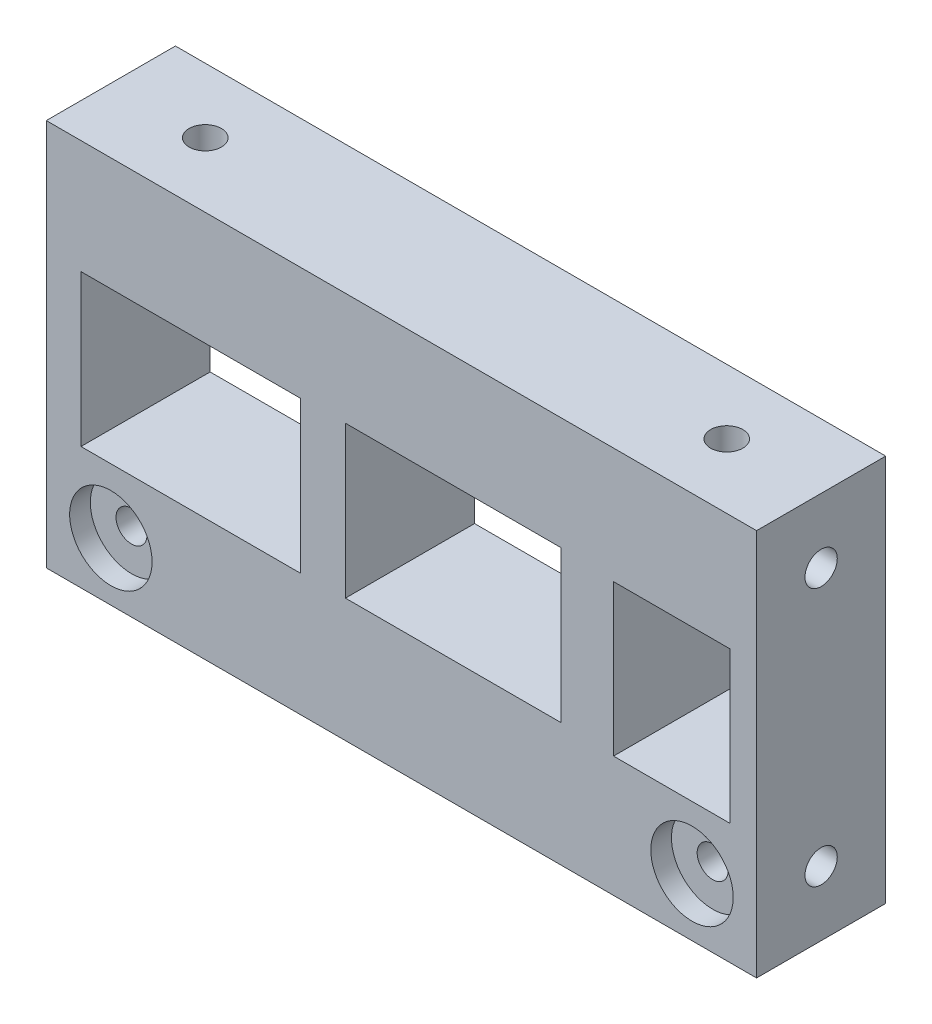
ISO-10303-21;
HEADER;
FILE_DESCRIPTION(('STEP AP214'),'2;1');
FILE_NAME('part.step','',(''),(''),'','','');
FILE_SCHEMA(('AUTOMOTIVE_DESIGN { 1 0 10303 214 1 1 1 1 }'));
ENDSEC;
DATA;
#1=APPLICATION_CONTEXT('core data for automotive mechanical design processes');
#2=APPLICATION_PROTOCOL_DEFINITION('international standard','automotive_design',2000,#1);
#3=PRODUCT_CONTEXT('',#1,'mechanical');
#4=PRODUCT('Part','Part','',(#3));
#5=PRODUCT_RELATED_PRODUCT_CATEGORY('part','',(#4));
#6=PRODUCT_DEFINITION_FORMATION('','',#4);
#7=PRODUCT_DEFINITION_CONTEXT('part definition',#1,'design');
#8=PRODUCT_DEFINITION('design','',#6,#7);
#9=PRODUCT_DEFINITION_SHAPE('','',#8);
#10=(LENGTH_UNIT() NAMED_UNIT(*) SI_UNIT(.MILLI.,.METRE.));
#11=(NAMED_UNIT(*) PLANE_ANGLE_UNIT() SI_UNIT($,.RADIAN.));
#12=(NAMED_UNIT(*) SI_UNIT($,.STERADIAN.) SOLID_ANGLE_UNIT());
#13=UNCERTAINTY_MEASURE_WITH_UNIT(LENGTH_MEASURE(1.E-05),#10,'distance_accuracy_value','');
#14=(GEOMETRIC_REPRESENTATION_CONTEXT(3) GLOBAL_UNCERTAINTY_ASSIGNED_CONTEXT((#13)) GLOBAL_UNIT_ASSIGNED_CONTEXT((#10,
#11,#12)) REPRESENTATION_CONTEXT('',''));
#15=CARTESIAN_POINT('',(0.,0.,0.));
#16=DIRECTION('',(0.,0.,1.));
#17=DIRECTION('',(1.,0.,0.));
#18=AXIS2_PLACEMENT_3D('',#15,#16,#17);
#19=CARTESIAN_POINT('',(0.,0.,0.));
#20=DIRECTION('',(0.,0.,-1.));
#21=DIRECTION('',(-1.,0.,0.));
#22=AXIS2_PLACEMENT_3D('',#19,#20,#21);
#23=PLANE('',#22);
#24=CARTESIAN_POINT('',(-22.5,-10.5,0.));
#25=DIRECTION('',(0.,0.,1.));
#26=DIRECTION('',(1.,0.,0.));
#27=AXIS2_PLACEMENT_3D('',#24,#25,#26);
#28=CIRCLE('',#27,1.2);
#29=CARTESIAN_POINT('',(-21.3,-10.5,0.));
#30=VERTEX_POINT('',#29);
#31=EDGE_CURVE('E254',#30,#30,#28,.T.);
#32=ORIENTED_EDGE('',*,*,#31,.T.);
#33=EDGE_LOOP('',(#32));
#34=FACE_BOUND('',#33,.T.);
#35=DIRECTION('',(0.,-1.,0.));
#36=VECTOR('',#35,1.);
#37=CARTESIAN_POINT('',(-27.5,15.,0.));
#38=LINE('',#37,#36);
#39=CARTESIAN_POINT('',(-27.5,15.,0.));
#40=VERTEX_POINT('',#39);
#41=CARTESIAN_POINT('',(-27.5,-15.,0.));
#42=VERTEX_POINT('',#41);
#43=EDGE_CURVE('E309',#40,#42,#38,.T.);
#44=ORIENTED_EDGE('',*,*,#43,.F.);
#45=DIRECTION('',(-1.,0.,0.));
#46=VECTOR('',#45,1.);
#47=CARTESIAN_POINT('',(27.5,15.,0.));
#48=LINE('',#47,#46);
#49=CARTESIAN_POINT('',(27.5,15.,0.));
#50=VERTEX_POINT('',#49);
#51=EDGE_CURVE('E408',#50,#40,#48,.T.);
#52=ORIENTED_EDGE('',*,*,#51,.F.);
#53=DIRECTION('',(0.,1.,0.));
#54=VECTOR('',#53,1.);
#55=CARTESIAN_POINT('',(27.5,15.,0.));
#56=LINE('',#55,#54);
#57=CARTESIAN_POINT('',(27.5,-15.,0.));
#58=VERTEX_POINT('',#57);
#59=EDGE_CURVE('E424',#58,#50,#56,.T.);
#60=ORIENTED_EDGE('',*,*,#59,.F.);
#61=DIRECTION('',(1.,0.,0.));
#62=VECTOR('',#61,1.);
#63=CARTESIAN_POINT('',(27.5,-15.,0.));
#64=LINE('',#63,#62);
#65=EDGE_CURVE('E421',#42,#58,#64,.T.);
#66=ORIENTED_EDGE('',*,*,#65,.F.);
#67=EDGE_LOOP('',(#44,#52,#60,#66));
#68=FACE_BOUND('',#67,.T.);
#69=DIRECTION('',(0.,-1.,0.));
#70=VECTOR('',#69,1.);
#71=CARTESIAN_POINT('',(16.4234049379665,6.0432442412431,0.));
#72=LINE('',#71,#70);
#73=CARTESIAN_POINT('',(16.4234049379665,6.0432442412431,0.));
#74=VERTEX_POINT('',#73);
#75=CARTESIAN_POINT('',(16.4234049379665,-5.6571127125536,0.));
#76=VERTEX_POINT('',#75);
#77=EDGE_CURVE('E379',#74,#76,#72,.T.);
#78=ORIENTED_EDGE('',*,*,#77,.T.);
#79=DIRECTION('',(1.,0.,0.));
#80=VECTOR('',#79,1.);
#81=CARTESIAN_POINT('',(16.4234049379665,-5.6571127125536,0.));
#82=LINE('',#81,#80);
#83=CARTESIAN_POINT('',(25.4527228042944,-5.6571127125536,0.));
#84=VERTEX_POINT('',#83);
#85=EDGE_CURVE('E396',#76,#84,#82,.T.);
#86=ORIENTED_EDGE('',*,*,#85,.T.);
#87=DIRECTION('',(0.,1.,0.));
#88=VECTOR('',#87,1.);
#89=CARTESIAN_POINT('',(25.4527228042944,6.0432442412431,0.));
#90=LINE('',#89,#88);
#91=CARTESIAN_POINT('',(25.4527228042944,6.0432442412431,0.));
#92=VERTEX_POINT('',#91);
#93=EDGE_CURVE('E392',#84,#92,#90,.T.);
#94=ORIENTED_EDGE('',*,*,#93,.T.);
#95=DIRECTION('',(-1.,0.,0.));
#96=VECTOR('',#95,1.);
#97=CARTESIAN_POINT('',(16.4234049379665,6.0432442412431,0.));
#98=LINE('',#97,#96);
#99=EDGE_CURVE('E365',#92,#74,#98,.T.);
#100=ORIENTED_EDGE('',*,*,#99,.T.);
#101=EDGE_LOOP('',(#78,#86,#94,#100));
#102=FACE_BOUND('',#101,.T.);
#103=DIRECTION('',(0.,-1.,0.));
#104=VECTOR('',#103,1.);
#105=CARTESIAN_POINT('',(-4.33691645548033,6.28718178778567,0.));
#106=LINE('',#105,#104);
#107=CARTESIAN_POINT('',(-4.33691645548033,6.28718178778567,0.));
#108=VERTEX_POINT('',#107);
#109=CARTESIAN_POINT('',(-4.33691645548033,-5.44382173933326,0.));
#110=VERTEX_POINT('',#109);
#111=EDGE_CURVE('E337',#108,#110,#106,.T.);
#112=ORIENTED_EDGE('',*,*,#111,.T.);
#113=DIRECTION('',(1.,0.,0.));
#114=VECTOR('',#113,1.);
#115=CARTESIAN_POINT('',(-4.33691645548033,-5.44382173933326,0.));
#116=LINE('',#115,#114);
#117=CARTESIAN_POINT('',(12.37087644678,-5.44382173933326,0.));
#118=VERTEX_POINT('',#117);
#119=EDGE_CURVE('E354',#110,#118,#116,.T.);
#120=ORIENTED_EDGE('',*,*,#119,.T.);
#121=DIRECTION('',(0.,1.,0.));
#122=VECTOR('',#121,1.);
#123=CARTESIAN_POINT('',(12.37087644678,6.28718178778567,0.));
#124=LINE('',#123,#122);
#125=CARTESIAN_POINT('',(12.37087644678,6.28718178778567,0.));
#126=VERTEX_POINT('',#125);
#127=EDGE_CURVE('E350',#118,#126,#124,.T.);
#128=ORIENTED_EDGE('',*,*,#127,.T.);
#129=DIRECTION('',(-1.,0.,0.));
#130=VECTOR('',#129,1.);
#131=CARTESIAN_POINT('',(-4.33691645548033,6.28718178778567,0.));
#132=LINE('',#131,#130);
#133=EDGE_CURVE('E321',#126,#108,#132,.T.);
#134=ORIENTED_EDGE('',*,*,#133,.T.);
#135=EDGE_LOOP('',(#112,#120,#128,#134));
#136=FACE_BOUND('',#135,.T.);
#137=DIRECTION('',(0.,-1.,0.));
#138=VECTOR('',#137,1.);
#139=CARTESIAN_POINT('',(-24.8128498846334,-5.51491873040671,0.));
#140=LINE('',#139,#138);
#141=CARTESIAN_POINT('',(-24.8128498846334,6.21608479671222,0.));
#142=VERTEX_POINT('',#141);
#143=CARTESIAN_POINT('',(-24.8128498846334,-5.51491873040671,0.));
#144=VERTEX_POINT('',#143);
#145=EDGE_CURVE('E275',#142,#144,#140,.T.);
#146=ORIENTED_EDGE('',*,*,#145,.T.);
#147=DIRECTION('',(1.,0.,0.));
#148=VECTOR('',#147,1.);
#149=CARTESIAN_POINT('',(-24.8128498846334,-5.51491873040671,0.));
#150=LINE('',#149,#148);
#151=CARTESIAN_POINT('',(-7.82066901807928,-5.51491873040671,0.));
#152=VERTEX_POINT('',#151);
#153=EDGE_CURVE('E279',#144,#152,#150,.T.);
#154=ORIENTED_EDGE('',*,*,#153,.T.);
#155=DIRECTION('',(0.,1.,0.));
#156=VECTOR('',#155,1.);
#157=CARTESIAN_POINT('',(-7.82066901807928,-5.51491873040671,0.));
#158=LINE('',#157,#156);
#159=CARTESIAN_POINT('',(-7.82066901807928,6.21608479671222,0.));
#160=VERTEX_POINT('',#159);
#161=EDGE_CURVE('E284',#152,#160,#158,.T.);
#162=ORIENTED_EDGE('',*,*,#161,.T.);
#163=DIRECTION('',(-1.,0.,0.));
#164=VECTOR('',#163,1.);
#165=CARTESIAN_POINT('',(-24.8128498846334,6.21608479671222,0.));
#166=LINE('',#165,#164);
#167=EDGE_CURVE('E288',#160,#142,#166,.T.);
#168=ORIENTED_EDGE('',*,*,#167,.T.);
#169=EDGE_LOOP('',(#146,#154,#162,#168));
#170=FACE_BOUND('',#169,.T.);
#171=CARTESIAN_POINT('',(22.5,-10.5,0.));
#172=DIRECTION('',(0.,0.,1.));
#173=DIRECTION('',(1.,0.,0.));
#174=AXIS2_PLACEMENT_3D('',#171,#172,#173);
#175=CIRCLE('',#174,1.2);
#176=CARTESIAN_POINT('',(23.7,-10.5,0.));
#177=VERTEX_POINT('',#176);
#178=EDGE_CURVE('E270',#177,#177,#175,.T.);
#179=ORIENTED_EDGE('',*,*,#178,.T.);
#180=EDGE_LOOP('',(#179));
#181=FACE_BOUND('',#180,.T.);
#182=ADVANCED_FACE('F55',(#34,#68,#102,#136,#170,#181),#23,.T.);
#183=CARTESIAN_POINT('',(-27.5,15.,10.));
#184=DIRECTION('',(1.,0.,0.));
#185=DIRECTION('',(0.,0.,-1.));
#186=AXIS2_PLACEMENT_3D('',#183,#184,#185);
#187=PLANE('',#186);
#188=CARTESIAN_POINT('',(-27.5,10.,5.));
#189=DIRECTION('',(-1.,0.,0.));
#190=DIRECTION('',(0.,0.,1.));
#191=AXIS2_PLACEMENT_3D('',#188,#189,#190);
#192=CIRCLE('',#191,1.25);
#193=CARTESIAN_POINT('',(-27.5,10.,6.25));
#194=VERTEX_POINT('',#193);
#195=EDGE_CURVE('E197',#194,#194,#192,.T.);
#196=ORIENTED_EDGE('',*,*,#195,.F.);
#197=EDGE_LOOP('',(#196));
#198=FACE_BOUND('',#197,.T.);
#199=CARTESIAN_POINT('',(-27.5,-10.,5.));
#200=DIRECTION('',(-1.,0.,0.));
#201=DIRECTION('',(0.,0.,1.));
#202=AXIS2_PLACEMENT_3D('',#199,#200,#201);
#203=CIRCLE('',#202,1.25);
#204=CARTESIAN_POINT('',(-27.5,-10.,6.25));
#205=VERTEX_POINT('',#204);
#206=EDGE_CURVE('E218',#205,#205,#203,.T.);
#207=ORIENTED_EDGE('',*,*,#206,.F.);
#208=EDGE_LOOP('',(#207));
#209=FACE_BOUND('',#208,.T.);
#210=ORIENTED_EDGE('',*,*,#43,.T.);
#211=DIRECTION('',(0.,0.,-1.));
#212=VECTOR('',#211,1.);
#213=CARTESIAN_POINT('',(-27.5,-15.,10.));
#214=LINE('',#213,#212);
#215=CARTESIAN_POINT('',(-27.5,-15.,10.));
#216=VERTEX_POINT('',#215);
#217=EDGE_CURVE('E11',#216,#42,#214,.T.);
#218=ORIENTED_EDGE('',*,*,#217,.F.);
#219=DIRECTION('',(0.,-1.,0.));
#220=VECTOR('',#219,1.);
#221=CARTESIAN_POINT('',(-27.5,15.,10.));
#222=LINE('',#221,#220);
#223=CARTESIAN_POINT('',(-27.5,15.,10.));
#224=VERTEX_POINT('',#223);
#225=EDGE_CURVE('E403',#224,#216,#222,.T.);
#226=ORIENTED_EDGE('',*,*,#225,.F.);
#227=DIRECTION('',(0.,0.,-1.));
#228=VECTOR('',#227,1.);
#229=CARTESIAN_POINT('',(-27.5,15.,10.));
#230=LINE('',#229,#228);
#231=EDGE_CURVE('E417',#224,#40,#230,.T.);
#232=ORIENTED_EDGE('',*,*,#231,.T.);
#233=EDGE_LOOP('',(#210,#218,#226,#232));
#234=FACE_BOUND('',#233,.T.);
#235=ADVANCED_FACE('F57',(#198,#209,#234),#187,.F.);
#236=CARTESIAN_POINT('',(27.5,-15.,10.));
#237=DIRECTION('',(0.,1.,0.));
#238=DIRECTION('',(0.,0.,1.));
#239=AXIS2_PLACEMENT_3D('',#236,#237,#238);
#240=PLANE('',#239);
#241=ORIENTED_EDGE('',*,*,#65,.T.);
#242=DIRECTION('',(0.,0.,-1.));
#243=VECTOR('',#242,1.);
#244=CARTESIAN_POINT('',(27.5,-15.,10.));
#245=LINE('',#244,#243);
#246=CARTESIAN_POINT('',(27.5,-15.,10.));
#247=VERTEX_POINT('',#246);
#248=EDGE_CURVE('E64',#247,#58,#245,.T.);
#249=ORIENTED_EDGE('',*,*,#248,.F.);
#250=DIRECTION('',(1.,0.,0.));
#251=VECTOR('',#250,1.);
#252=CARTESIAN_POINT('',(27.5,-15.,10.));
#253=LINE('',#252,#251);
#254=EDGE_CURVE('E407',#216,#247,#253,.T.);
#255=ORIENTED_EDGE('',*,*,#254,.F.);
#256=ORIENTED_EDGE('',*,*,#217,.T.);
#257=EDGE_LOOP('',(#241,#249,#255,#256));
#258=FACE_BOUND('',#257,.T.);
#259=ADVANCED_FACE('F457',(#258),#240,.F.);
#260=CARTESIAN_POINT('',(27.5,15.,10.));
#261=DIRECTION('',(-1.,0.,0.));
#262=DIRECTION('',(0.,0.,1.));
#263=AXIS2_PLACEMENT_3D('',#260,#261,#262);
#264=PLANE('',#263);
#265=CARTESIAN_POINT('',(27.5,10.,5.));
#266=DIRECTION('',(1.,0.,0.));
#267=DIRECTION('',(0.,0.,-1.));
#268=AXIS2_PLACEMENT_3D('',#265,#266,#267);
#269=CIRCLE('',#268,1.25);
#270=CARTESIAN_POINT('',(27.5,10.,3.75));
#271=VERTEX_POINT('',#270);
#272=EDGE_CURVE('E196',#271,#271,#269,.T.);
#273=ORIENTED_EDGE('',*,*,#272,.F.);
#274=EDGE_LOOP('',(#273));
#275=FACE_BOUND('',#274,.T.);
#276=CARTESIAN_POINT('',(27.5,-10.,5.));
#277=DIRECTION('',(1.,0.,0.));
#278=DIRECTION('',(0.,0.,-1.));
#279=AXIS2_PLACEMENT_3D('',#276,#277,#278);
#280=CIRCLE('',#279,1.25);
#281=CARTESIAN_POINT('',(27.5,-10.,3.75));
#282=VERTEX_POINT('',#281);
#283=EDGE_CURVE('E210',#282,#282,#280,.T.);
#284=ORIENTED_EDGE('',*,*,#283,.F.);
#285=EDGE_LOOP('',(#284));
#286=FACE_BOUND('',#285,.T.);
#287=ORIENTED_EDGE('',*,*,#59,.T.);
#288=DIRECTION('',(0.,0.,-1.));
#289=VECTOR('',#288,1.);
#290=CARTESIAN_POINT('',(27.5,15.,10.));
#291=LINE('',#290,#289);
#292=CARTESIAN_POINT('',(27.5,15.,10.));
#293=VERTEX_POINT('',#292);
#294=EDGE_CURVE('E432',#293,#50,#291,.T.);
#295=ORIENTED_EDGE('',*,*,#294,.F.);
#296=DIRECTION('',(0.,1.,0.));
#297=VECTOR('',#296,1.);
#298=CARTESIAN_POINT('',(27.5,15.,10.));
#299=LINE('',#298,#297);
#300=EDGE_CURVE('E411',#247,#293,#299,.T.);
#301=ORIENTED_EDGE('',*,*,#300,.F.);
#302=ORIENTED_EDGE('',*,*,#248,.T.);
#303=EDGE_LOOP('',(#287,#295,#301,#302));
#304=FACE_BOUND('',#303,.T.);
#305=ADVANCED_FACE('F441',(#275,#286,#304),#264,.F.);
#306=CARTESIAN_POINT('',(27.5,15.,10.));
#307=DIRECTION('',(0.,-1.,0.));
#308=DIRECTION('',(0.,0.,-1.));
#309=AXIS2_PLACEMENT_3D('',#306,#307,#308);
#310=PLANE('',#309);
#311=CARTESIAN_POINT('',(-20.1915454648592,15.,5.00000000000001));
#312=DIRECTION('',(0.,1.,0.));
#313=DIRECTION('',(0.,0.,1.));
#314=AXIS2_PLACEMENT_3D('',#311,#312,#313);
#315=CIRCLE('',#314,1.25);
#316=CARTESIAN_POINT('',(-20.1915454648592,15.,6.25000000000001));
#317=VERTEX_POINT('',#316);
#318=EDGE_CURVE('E226',#317,#317,#315,.T.);
#319=ORIENTED_EDGE('',*,*,#318,.F.);
#320=EDGE_LOOP('',(#319));
#321=FACE_BOUND('',#320,.T.);
#322=CARTESIAN_POINT('',(20.1915454648592,15.,5.00000000000001));
#323=DIRECTION('',(0.,1.,0.));
#324=DIRECTION('',(0.,0.,1.));
#325=AXIS2_PLACEMENT_3D('',#322,#323,#324);
#326=CIRCLE('',#325,1.25);
#327=CARTESIAN_POINT('',(20.1915454648592,15.,6.25000000000001));
#328=VERTEX_POINT('',#327);
#329=EDGE_CURVE('E234',#328,#328,#326,.T.);
#330=ORIENTED_EDGE('',*,*,#329,.F.);
#331=EDGE_LOOP('',(#330));
#332=FACE_BOUND('',#331,.T.);
#333=ORIENTED_EDGE('',*,*,#51,.T.);
#334=ORIENTED_EDGE('',*,*,#231,.F.);
#335=DIRECTION('',(-1.,0.,0.));
#336=VECTOR('',#335,1.);
#337=CARTESIAN_POINT('',(27.5,15.,10.));
#338=LINE('',#337,#336);
#339=EDGE_CURVE('E414',#293,#224,#338,.T.);
#340=ORIENTED_EDGE('',*,*,#339,.F.);
#341=ORIENTED_EDGE('',*,*,#294,.T.);
#342=EDGE_LOOP('',(#333,#334,#340,#341));
#343=FACE_BOUND('',#342,.T.);
#344=ADVANCED_FACE('F450',(#321,#332,#343),#310,.F.);
#345=CARTESIAN_POINT('',(0.,0.,10.));
#346=DIRECTION('',(0.,0.,-1.));
#347=DIRECTION('',(-1.,0.,0.));
#348=AXIS2_PLACEMENT_3D('',#345,#346,#347);
#349=PLANE('',#348);
#350=CARTESIAN_POINT('',(-22.5,-10.5,10.));
#351=DIRECTION('',(0.,0.,1.));
#352=DIRECTION('',(1.,0.,0.));
#353=AXIS2_PLACEMENT_3D('',#350,#351,#352);
#354=CIRCLE('',#353,3.19);
#355=CARTESIAN_POINT('',(-19.31,-10.5,10.));
#356=VERTEX_POINT('',#355);
#357=EDGE_CURVE('E242',#356,#356,#354,.T.);
#358=ORIENTED_EDGE('',*,*,#357,.F.);
#359=EDGE_LOOP('',(#358));
#360=FACE_BOUND('',#359,.T.);
#361=CARTESIAN_POINT('',(22.5,-10.5,10.));
#362=DIRECTION('',(0.,0.,1.));
#363=DIRECTION('',(1.,0.,0.));
#364=AXIS2_PLACEMENT_3D('',#361,#362,#363);
#365=CIRCLE('',#364,3.19);
#366=CARTESIAN_POINT('',(25.69,-10.5,10.));
#367=VERTEX_POINT('',#366);
#368=EDGE_CURVE('E258',#367,#367,#365,.T.);
#369=ORIENTED_EDGE('',*,*,#368,.F.);
#370=EDGE_LOOP('',(#369));
#371=FACE_BOUND('',#370,.T.);
#372=DIRECTION('',(1.,0.,0.));
#373=VECTOR('',#372,1.);
#374=CARTESIAN_POINT('',(-24.8128498846334,-5.51491873040671,10.));
#375=LINE('',#374,#373);
#376=CARTESIAN_POINT('',(-24.8128498846334,-5.51491873040671,10.));
#377=VERTEX_POINT('',#376);
#378=CARTESIAN_POINT('',(-7.82066901807928,-5.51491873040671,10.));
#379=VERTEX_POINT('',#378);
#380=EDGE_CURVE('E295',#377,#379,#375,.T.);
#381=ORIENTED_EDGE('',*,*,#380,.F.);
#382=DIRECTION('',(0.,-1.,0.));
#383=VECTOR('',#382,1.);
#384=CARTESIAN_POINT('',(-24.8128498846334,-5.51491873040671,10.));
#385=LINE('',#384,#383);
#386=CARTESIAN_POINT('',(-24.8128498846334,6.21608479671222,10.));
#387=VERTEX_POINT('',#386);
#388=EDGE_CURVE('E71',#387,#377,#385,.T.);
#389=ORIENTED_EDGE('',*,*,#388,.F.);
#390=DIRECTION('',(-1.,0.,0.));
#391=VECTOR('',#390,1.);
#392=CARTESIAN_POINT('',(-24.8128498846334,6.21608479671222,10.));
#393=LINE('',#392,#391);
#394=CARTESIAN_POINT('',(-7.82066901807928,6.21608479671222,10.));
#395=VERTEX_POINT('',#394);
#396=EDGE_CURVE('E280',#395,#387,#393,.T.);
#397=ORIENTED_EDGE('',*,*,#396,.F.);
#398=DIRECTION('',(0.,1.,0.));
#399=VECTOR('',#398,1.);
#400=CARTESIAN_POINT('',(-7.82066901807928,-5.51491873040671,10.));
#401=LINE('',#400,#399);
#402=EDGE_CURVE('E299',#379,#395,#401,.T.);
#403=ORIENTED_EDGE('',*,*,#402,.F.);
#404=EDGE_LOOP('',(#381,#389,#397,#403));
#405=FACE_BOUND('',#404,.T.);
#406=DIRECTION('',(1.,0.,0.));
#407=VECTOR('',#406,1.);
#408=CARTESIAN_POINT('',(-4.33691645548033,-5.44382173933326,10.));
#409=LINE('',#408,#407);
#410=CARTESIAN_POINT('',(-4.33691645548033,-5.44382173933326,10.));
#411=VERTEX_POINT('',#410);
#412=CARTESIAN_POINT('',(12.37087644678,-5.44382173933326,10.));
#413=VERTEX_POINT('',#412);
#414=EDGE_CURVE('E341',#411,#413,#409,.T.);
#415=ORIENTED_EDGE('',*,*,#414,.F.);
#416=DIRECTION('',(0.,-1.,0.));
#417=VECTOR('',#416,1.);
#418=CARTESIAN_POINT('',(-4.33691645548033,6.28718178778567,10.));
#419=LINE('',#418,#417);
#420=CARTESIAN_POINT('',(-4.33691645548033,6.28718178778567,10.));
#421=VERTEX_POINT('',#420);
#422=EDGE_CURVE('E79',#421,#411,#419,.T.);
#423=ORIENTED_EDGE('',*,*,#422,.F.);
#424=DIRECTION('',(-1.,0.,0.));
#425=VECTOR('',#424,1.);
#426=CARTESIAN_POINT('',(-4.33691645548033,6.28718178778567,10.));
#427=LINE('',#426,#425);
#428=CARTESIAN_POINT('',(12.37087644678,6.28718178778567,10.));
#429=VERTEX_POINT('',#428);
#430=EDGE_CURVE('E332',#429,#421,#427,.T.);
#431=ORIENTED_EDGE('',*,*,#430,.F.);
#432=DIRECTION('',(0.,1.,0.));
#433=VECTOR('',#432,1.);
#434=CARTESIAN_POINT('',(12.37087644678,6.28718178778567,10.));
#435=LINE('',#434,#433);
#436=EDGE_CURVE('E336',#413,#429,#435,.T.);
#437=ORIENTED_EDGE('',*,*,#436,.F.);
#438=EDGE_LOOP('',(#415,#423,#431,#437));
#439=FACE_BOUND('',#438,.T.);
#440=DIRECTION('',(1.,0.,0.));
#441=VECTOR('',#440,1.);
#442=CARTESIAN_POINT('',(16.4234049379665,-5.6571127125536,10.));
#443=LINE('',#442,#441);
#444=CARTESIAN_POINT('',(16.4234049379665,-5.6571127125536,10.));
#445=VERTEX_POINT('',#444);
#446=CARTESIAN_POINT('',(25.4527228042944,-5.6571127125536,10.));
#447=VERTEX_POINT('',#446);
#448=EDGE_CURVE('E383',#445,#447,#443,.T.);
#449=ORIENTED_EDGE('',*,*,#448,.F.);
#450=DIRECTION('',(0.,-1.,0.));
#451=VECTOR('',#450,1.);
#452=CARTESIAN_POINT('',(16.4234049379665,6.0432442412431,10.));
#453=LINE('',#452,#451);
#454=CARTESIAN_POINT('',(16.4234049379665,6.0432442412431,10.));
#455=VERTEX_POINT('',#454);
#456=EDGE_CURVE('E331',#455,#445,#453,.T.);
#457=ORIENTED_EDGE('',*,*,#456,.F.);
#458=DIRECTION('',(-1.,0.,0.));
#459=VECTOR('',#458,1.);
#460=CARTESIAN_POINT('',(16.4234049379665,6.0432442412431,10.));
#461=LINE('',#460,#459);
#462=CARTESIAN_POINT('',(25.4527228042944,6.0432442412431,10.));
#463=VERTEX_POINT('',#462);
#464=EDGE_CURVE('E374',#463,#455,#461,.T.);
#465=ORIENTED_EDGE('',*,*,#464,.F.);
#466=DIRECTION('',(0.,1.,0.));
#467=VECTOR('',#466,1.);
#468=CARTESIAN_POINT('',(25.4527228042944,6.0432442412431,10.));
#469=LINE('',#468,#467);
#470=EDGE_CURVE('E378',#447,#463,#469,.T.);
#471=ORIENTED_EDGE('',*,*,#470,.F.);
#472=EDGE_LOOP('',(#449,#457,#465,#471));
#473=FACE_BOUND('',#472,.T.);
#474=ORIENTED_EDGE('',*,*,#225,.T.);
#475=ORIENTED_EDGE('',*,*,#254,.T.);
#476=ORIENTED_EDGE('',*,*,#300,.T.);
#477=ORIENTED_EDGE('',*,*,#339,.T.);
#478=EDGE_LOOP('',(#474,#475,#476,#477));
#479=FACE_BOUND('',#478,.T.);
#480=ADVANCED_FACE('F456',(#360,#371,#405,#439,#473,#479),#349,.F.);
#481=CARTESIAN_POINT('',(16.4234049379665,6.0432442412431,0.));
#482=DIRECTION('',(-1.,0.,0.));
#483=DIRECTION('',(0.,0.,1.));
#484=AXIS2_PLACEMENT_3D('',#481,#482,#483);
#485=PLANE('',#484);
#486=ORIENTED_EDGE('',*,*,#456,.T.);
#487=DIRECTION('',(0.,0.,1.));
#488=VECTOR('',#487,1.);
#489=CARTESIAN_POINT('',(16.4234049379665,-5.6571127125536,0.));
#490=LINE('',#489,#488);
#491=EDGE_CURVE('E361',#76,#445,#490,.T.);
#492=ORIENTED_EDGE('',*,*,#491,.F.);
#493=ORIENTED_EDGE('',*,*,#77,.F.);
#494=DIRECTION('',(0.,0.,1.));
#495=VECTOR('',#494,1.);
#496=CARTESIAN_POINT('',(16.4234049379665,6.0432442412431,0.));
#497=LINE('',#496,#495);
#498=EDGE_CURVE('E274',#74,#455,#497,.T.);
#499=ORIENTED_EDGE('',*,*,#498,.T.);
#500=EDGE_LOOP('',(#486,#492,#493,#499));
#501=FACE_BOUND('',#500,.T.);
#502=ADVANCED_FACE('F483',(#501),#485,.F.);
#503=CARTESIAN_POINT('',(16.4234049379665,6.0432442412431,0.));
#504=DIRECTION('',(0.,1.,0.));
#505=DIRECTION('',(0.,0.,1.));
#506=AXIS2_PLACEMENT_3D('',#503,#504,#505);
#507=PLANE('',#506);
#508=ORIENTED_EDGE('',*,*,#464,.T.);
#509=ORIENTED_EDGE('',*,*,#498,.F.);
#510=ORIENTED_EDGE('',*,*,#99,.F.);
#511=DIRECTION('',(0.,0.,1.));
#512=VECTOR('',#511,1.);
#513=CARTESIAN_POINT('',(25.4527228042944,6.0432442412431,0.));
#514=LINE('',#513,#512);
#515=EDGE_CURVE('E369',#92,#463,#514,.T.);
#516=ORIENTED_EDGE('',*,*,#515,.T.);
#517=EDGE_LOOP('',(#508,#509,#510,#516));
#518=FACE_BOUND('',#517,.T.);
#519=ADVANCED_FACE('F563',(#518),#507,.F.);
#520=CARTESIAN_POINT('',(25.4527228042944,6.0432442412431,0.));
#521=DIRECTION('',(1.,0.,0.));
#522=DIRECTION('',(0.,0.,-1.));
#523=AXIS2_PLACEMENT_3D('',#520,#521,#522);
#524=PLANE('',#523);
#525=ORIENTED_EDGE('',*,*,#470,.T.);
#526=ORIENTED_EDGE('',*,*,#515,.F.);
#527=ORIENTED_EDGE('',*,*,#93,.F.);
#528=DIRECTION('',(0.,0.,1.));
#529=VECTOR('',#528,1.);
#530=CARTESIAN_POINT('',(25.4527228042944,-5.6571127125536,0.));
#531=LINE('',#530,#529);
#532=EDGE_CURVE('E366',#84,#447,#531,.T.);
#533=ORIENTED_EDGE('',*,*,#532,.T.);
#534=EDGE_LOOP('',(#525,#526,#527,#533));
#535=FACE_BOUND('',#534,.T.);
#536=ADVANCED_FACE('F567',(#535),#524,.F.);
#537=CARTESIAN_POINT('',(16.4234049379665,-5.6571127125536,0.));
#538=DIRECTION('',(0.,-1.,0.));
#539=DIRECTION('',(0.,0.,-1.));
#540=AXIS2_PLACEMENT_3D('',#537,#538,#539);
#541=PLANE('',#540);
#542=ORIENTED_EDGE('',*,*,#448,.T.);
#543=ORIENTED_EDGE('',*,*,#532,.F.);
#544=ORIENTED_EDGE('',*,*,#85,.F.);
#545=ORIENTED_EDGE('',*,*,#491,.T.);
#546=EDGE_LOOP('',(#542,#543,#544,#545));
#547=FACE_BOUND('',#546,.T.);
#548=ADVANCED_FACE('F551',(#547),#541,.F.);
#549=CARTESIAN_POINT('',(-4.33691645548033,6.28718178778567,0.));
#550=DIRECTION('',(-1.,0.,0.));
#551=DIRECTION('',(0.,-1.,0.));
#552=AXIS2_PLACEMENT_3D('',#549,#550,#551);
#553=PLANE('',#552);
#554=ORIENTED_EDGE('',*,*,#422,.T.);
#555=DIRECTION('',(0.,0.,1.));
#556=VECTOR('',#555,1.);
#557=CARTESIAN_POINT('',(-4.33691645548033,-5.44382173933326,0.));
#558=LINE('',#557,#556);
#559=EDGE_CURVE('E318',#110,#411,#558,.T.);
#560=ORIENTED_EDGE('',*,*,#559,.F.);
#561=ORIENTED_EDGE('',*,*,#111,.F.);
#562=DIRECTION('',(0.,0.,1.));
#563=VECTOR('',#562,1.);
#564=CARTESIAN_POINT('',(-4.33691645548033,6.28718178778567,0.));
#565=LINE('',#564,#563);
#566=EDGE_CURVE('E328',#108,#421,#565,.T.);
#567=ORIENTED_EDGE('',*,*,#566,.T.);
#568=EDGE_LOOP('',(#554,#560,#561,#567));
#569=FACE_BOUND('',#568,.T.);
#570=ADVANCED_FACE('F547',(#569),#553,.F.);
#571=CARTESIAN_POINT('',(-4.33691645548033,6.28718178778567,0.));
#572=DIRECTION('',(0.,1.,0.));
#573=DIRECTION('',(0.,0.,1.));
#574=AXIS2_PLACEMENT_3D('',#571,#572,#573);
#575=PLANE('',#574);
#576=ORIENTED_EDGE('',*,*,#430,.T.);
#577=ORIENTED_EDGE('',*,*,#566,.F.);
#578=ORIENTED_EDGE('',*,*,#133,.F.);
#579=DIRECTION('',(0.,0.,1.));
#580=VECTOR('',#579,1.);
#581=CARTESIAN_POINT('',(12.37087644678,6.28718178778567,0.));
#582=LINE('',#581,#580);
#583=EDGE_CURVE('E325',#126,#429,#582,.T.);
#584=ORIENTED_EDGE('',*,*,#583,.T.);
#585=EDGE_LOOP('',(#576,#577,#578,#584));
#586=FACE_BOUND('',#585,.T.);
#587=ADVANCED_FACE('F550',(#586),#575,.F.);
#588=CARTESIAN_POINT('',(12.37087644678,6.28718178778567,0.));
#589=DIRECTION('',(1.,0.,0.));
#590=DIRECTION('',(0.,1.,0.));
#591=AXIS2_PLACEMENT_3D('',#588,#589,#590);
#592=PLANE('',#591);
#593=ORIENTED_EDGE('',*,*,#436,.T.);
#594=ORIENTED_EDGE('',*,*,#583,.F.);
#595=ORIENTED_EDGE('',*,*,#127,.F.);
#596=DIRECTION('',(0.,0.,1.));
#597=VECTOR('',#596,1.);
#598=CARTESIAN_POINT('',(12.37087644678,-5.44382173933326,0.));
#599=LINE('',#598,#597);
#600=EDGE_CURVE('E322',#118,#413,#599,.T.);
#601=ORIENTED_EDGE('',*,*,#600,.T.);
#602=EDGE_LOOP('',(#593,#594,#595,#601));
#603=FACE_BOUND('',#602,.T.);
#604=ADVANCED_FACE('F554',(#603),#592,.F.);
#605=CARTESIAN_POINT('',(-4.33691645548033,-5.44382173933326,0.));
#606=DIRECTION('',(0.,-1.,0.));
#607=DIRECTION('',(0.,0.,-1.));
#608=AXIS2_PLACEMENT_3D('',#605,#606,#607);
#609=PLANE('',#608);
#610=ORIENTED_EDGE('',*,*,#414,.T.);
#611=ORIENTED_EDGE('',*,*,#600,.F.);
#612=ORIENTED_EDGE('',*,*,#119,.F.);
#613=ORIENTED_EDGE('',*,*,#559,.T.);
#614=EDGE_LOOP('',(#610,#611,#612,#613));
#615=FACE_BOUND('',#614,.T.);
#616=ADVANCED_FACE('F546',(#615),#609,.F.);
#617=CARTESIAN_POINT('',(-24.8128498846334,-5.51491873040671,0.));
#618=DIRECTION('',(-1.,0.,0.));
#619=DIRECTION('',(0.,0.,1.));
#620=AXIS2_PLACEMENT_3D('',#617,#618,#619);
#621=PLANE('',#620);
#622=ORIENTED_EDGE('',*,*,#388,.T.);
#623=DIRECTION('',(0.,0.,1.));
#624=VECTOR('',#623,1.);
#625=CARTESIAN_POINT('',(-24.8128498846334,-5.51491873040671,0.));
#626=LINE('',#625,#624);
#627=EDGE_CURVE('E292',#144,#377,#626,.T.);
#628=ORIENTED_EDGE('',*,*,#627,.F.);
#629=ORIENTED_EDGE('',*,*,#145,.F.);
#630=DIRECTION('',(0.,0.,1.));
#631=VECTOR('',#630,1.);
#632=CARTESIAN_POINT('',(-24.8128498846334,6.21608479671222,0.));
#633=LINE('',#632,#631);
#634=EDGE_CURVE('E306',#142,#387,#633,.T.);
#635=ORIENTED_EDGE('',*,*,#634,.T.);
#636=EDGE_LOOP('',(#622,#628,#629,#635));
#637=FACE_BOUND('',#636,.T.);
#638=ADVANCED_FACE('F537',(#637),#621,.F.);
#639=CARTESIAN_POINT('',(-24.8128498846334,6.21608479671222,0.));
#640=DIRECTION('',(0.,1.,0.));
#641=DIRECTION('',(0.,0.,1.));
#642=AXIS2_PLACEMENT_3D('',#639,#640,#641);
#643=PLANE('',#642);
#644=ORIENTED_EDGE('',*,*,#396,.T.);
#645=ORIENTED_EDGE('',*,*,#634,.F.);
#646=ORIENTED_EDGE('',*,*,#167,.F.);
#647=DIRECTION('',(0.,0.,1.));
#648=VECTOR('',#647,1.);
#649=CARTESIAN_POINT('',(-7.82066901807928,6.21608479671222,0.));
#650=LINE('',#649,#648);
#651=EDGE_CURVE('E310',#160,#395,#650,.T.);
#652=ORIENTED_EDGE('',*,*,#651,.T.);
#653=EDGE_LOOP('',(#644,#645,#646,#652));
#654=FACE_BOUND('',#653,.T.);
#655=ADVANCED_FACE('F533',(#654),#643,.F.);
#656=CARTESIAN_POINT('',(-7.82066901807928,-5.51491873040671,0.));
#657=DIRECTION('',(1.,0.,0.));
#658=DIRECTION('',(0.,0.,-1.));
#659=AXIS2_PLACEMENT_3D('',#656,#657,#658);
#660=PLANE('',#659);
#661=ORIENTED_EDGE('',*,*,#402,.T.);
#662=ORIENTED_EDGE('',*,*,#651,.F.);
#663=ORIENTED_EDGE('',*,*,#161,.F.);
#664=DIRECTION('',(0.,0.,1.));
#665=VECTOR('',#664,1.);
#666=CARTESIAN_POINT('',(-7.82066901807928,-5.51491873040671,0.));
#667=LINE('',#666,#665);
#668=EDGE_CURVE('E313',#152,#379,#667,.T.);
#669=ORIENTED_EDGE('',*,*,#668,.T.);
#670=EDGE_LOOP('',(#661,#662,#663,#669));
#671=FACE_BOUND('',#670,.T.);
#672=ADVANCED_FACE('F536',(#671),#660,.F.);
#673=CARTESIAN_POINT('',(-24.8128498846334,-5.51491873040671,0.));
#674=DIRECTION('',(0.,-1.,0.));
#675=DIRECTION('',(0.,0.,-1.));
#676=AXIS2_PLACEMENT_3D('',#673,#674,#675);
#677=PLANE('',#676);
#678=ORIENTED_EDGE('',*,*,#380,.T.);
#679=ORIENTED_EDGE('',*,*,#668,.F.);
#680=ORIENTED_EDGE('',*,*,#153,.F.);
#681=ORIENTED_EDGE('',*,*,#627,.T.);
#682=EDGE_LOOP('',(#678,#679,#680,#681));
#683=FACE_BOUND('',#682,.T.);
#684=ADVANCED_FACE('F531',(#683),#677,.F.);
#685=CARTESIAN_POINT('',(22.5,-10.5,10.));
#686=DIRECTION('',(0.,0.,1.));
#687=DIRECTION('',(1.,0.,0.));
#688=AXIS2_PLACEMENT_3D('',#685,#686,#687);
#689=CYLINDRICAL_SURFACE('',#688,1.2);
#690=ORIENTED_EDGE('',*,*,#178,.F.);
#691=EDGE_LOOP('',(#690));
#692=FACE_BOUND('',#691,.T.);
#693=CARTESIAN_POINT('',(22.5,-10.5,8.4));
#694=DIRECTION('',(0.,0.,1.));
#695=DIRECTION('',(1.,0.,0.));
#696=AXIS2_PLACEMENT_3D('',#693,#694,#695);
#697=CIRCLE('',#696,1.2);
#698=CARTESIAN_POINT('',(23.7,-10.5,8.4));
#699=VERTEX_POINT('',#698);
#700=EDGE_CURVE('E266',#699,#699,#697,.T.);
#701=ORIENTED_EDGE('',*,*,#700,.T.);
#702=EDGE_LOOP('',(#701));
#703=FACE_BOUND('',#702,.T.);
#704=ADVANCED_FACE('F527',(#692,#703),#689,.F.);
#705=CARTESIAN_POINT('',(23.7,-10.5,8.4));
#706=DIRECTION('',(0.,0.,-1.));
#707=DIRECTION('',(-1.,0.,0.));
#708=AXIS2_PLACEMENT_3D('',#705,#706,#707);
#709=PLANE('',#708);
#710=ORIENTED_EDGE('',*,*,#700,.F.);
#711=EDGE_LOOP('',(#710));
#712=FACE_BOUND('',#711,.T.);
#713=CARTESIAN_POINT('',(22.5,-10.5,8.4));
#714=DIRECTION('',(0.,0.,1.));
#715=DIRECTION('',(1.,0.,0.));
#716=AXIS2_PLACEMENT_3D('',#713,#714,#715);
#717=CIRCLE('',#716,3.19);
#718=CARTESIAN_POINT('',(25.69,-10.5,8.4));
#719=VERTEX_POINT('',#718);
#720=EDGE_CURVE('E262',#719,#719,#717,.T.);
#721=ORIENTED_EDGE('',*,*,#720,.T.);
#722=EDGE_LOOP('',(#721));
#723=FACE_BOUND('',#722,.T.);
#724=ADVANCED_FACE('F523',(#712,#723),#709,.F.);
#725=CARTESIAN_POINT('',(22.5,-10.5,10.));
#726=DIRECTION('',(0.,0.,1.));
#727=DIRECTION('',(1.,0.,0.));
#728=AXIS2_PLACEMENT_3D('',#725,#726,#727);
#729=CYLINDRICAL_SURFACE('',#728,3.19);
#730=ORIENTED_EDGE('',*,*,#720,.F.);
#731=EDGE_LOOP('',(#730));
#732=FACE_BOUND('',#731,.T.);
#733=ORIENTED_EDGE('',*,*,#368,.T.);
#734=EDGE_LOOP('',(#733));
#735=FACE_BOUND('',#734,.T.);
#736=ADVANCED_FACE('F519',(#732,#735),#729,.F.);
#737=CARTESIAN_POINT('',(-22.5,-10.5,10.));
#738=DIRECTION('',(0.,0.,1.));
#739=DIRECTION('',(1.,0.,0.));
#740=AXIS2_PLACEMENT_3D('',#737,#738,#739);
#741=CYLINDRICAL_SURFACE('',#740,1.2);
#742=ORIENTED_EDGE('',*,*,#31,.F.);
#743=EDGE_LOOP('',(#742));
#744=FACE_BOUND('',#743,.T.);
#745=CARTESIAN_POINT('',(-22.5,-10.5,8.4));
#746=DIRECTION('',(0.,0.,1.));
#747=DIRECTION('',(1.,0.,0.));
#748=AXIS2_PLACEMENT_3D('',#745,#746,#747);
#749=CIRCLE('',#748,1.2);
#750=CARTESIAN_POINT('',(-21.3,-10.5,8.4));
#751=VERTEX_POINT('',#750);
#752=EDGE_CURVE('E250',#751,#751,#749,.T.);
#753=ORIENTED_EDGE('',*,*,#752,.T.);
#754=EDGE_LOOP('',(#753));
#755=FACE_BOUND('',#754,.T.);
#756=ADVANCED_FACE('F515',(#744,#755),#741,.F.);
#757=CARTESIAN_POINT('',(-21.3,-10.5,8.4));
#758=DIRECTION('',(0.,0.,-1.));
#759=DIRECTION('',(-1.,0.,0.));
#760=AXIS2_PLACEMENT_3D('',#757,#758,#759);
#761=PLANE('',#760);
#762=ORIENTED_EDGE('',*,*,#752,.F.);
#763=EDGE_LOOP('',(#762));
#764=FACE_BOUND('',#763,.T.);
#765=CARTESIAN_POINT('',(-22.5,-10.5,8.4));
#766=DIRECTION('',(0.,0.,1.));
#767=DIRECTION('',(1.,0.,0.));
#768=AXIS2_PLACEMENT_3D('',#765,#766,#767);
#769=CIRCLE('',#768,3.19);
#770=CARTESIAN_POINT('',(-19.31,-10.5,8.4));
#771=VERTEX_POINT('',#770);
#772=EDGE_CURVE('E246',#771,#771,#769,.T.);
#773=ORIENTED_EDGE('',*,*,#772,.T.);
#774=EDGE_LOOP('',(#773));
#775=FACE_BOUND('',#774,.T.);
#776=ADVANCED_FACE('F511',(#764,#775),#761,.F.);
#777=CARTESIAN_POINT('',(-22.5,-10.5,10.));
#778=DIRECTION('',(0.,0.,1.));
#779=DIRECTION('',(1.,0.,0.));
#780=AXIS2_PLACEMENT_3D('',#777,#778,#779);
#781=CYLINDRICAL_SURFACE('',#780,3.19);
#782=ORIENTED_EDGE('',*,*,#772,.F.);
#783=EDGE_LOOP('',(#782));
#784=FACE_BOUND('',#783,.T.);
#785=ORIENTED_EDGE('',*,*,#357,.T.);
#786=EDGE_LOOP('',(#785));
#787=FACE_BOUND('',#786,.T.);
#788=ADVANCED_FACE('F504',(#784,#787),#781,.F.);
#789=CARTESIAN_POINT('',(20.1915454648592,12.,5.00000000000001));
#790=DIRECTION('',(0.,1.,0.));
#791=DIRECTION('',(0.,0.,1.));
#792=AXIS2_PLACEMENT_3D('',#789,#790,#791);
#793=CONICAL_SURFACE('',#792,1.25,1.02974425867665);
#794=CARTESIAN_POINT('',(20.1915454648592,11.2489242262155,5.00000000000001));
#795=VERTEX_POINT('',#794);
#796=VERTEX_LOOP('',#795);
#797=FACE_BOUND('',#796,.T.);
#798=CARTESIAN_POINT('',(20.1915454648592,12.,5.00000000000001));
#799=DIRECTION('',(0.,1.,0.));
#800=DIRECTION('',(0.,0.,1.));
#801=AXIS2_PLACEMENT_3D('',#798,#799,#800);
#802=CIRCLE('',#801,1.25);
#803=CARTESIAN_POINT('',(20.1915454648592,12.,6.25000000000001));
#804=VERTEX_POINT('',#803);
#805=EDGE_CURVE('E238',#804,#804,#802,.T.);
#806=ORIENTED_EDGE('',*,*,#805,.T.);
#807=EDGE_LOOP('',(#806));
#808=FACE_BOUND('',#807,.T.);
#809=ADVANCED_FACE('F492',(#797,#808),#793,.F.);
#810=CARTESIAN_POINT('',(20.1915454648592,15.,5.00000000000001));
#811=DIRECTION('',(0.,1.,0.));
#812=DIRECTION('',(0.,0.,1.));
#813=AXIS2_PLACEMENT_3D('',#810,#811,#812);
#814=CYLINDRICAL_SURFACE('',#813,1.25);
#815=ORIENTED_EDGE('',*,*,#805,.F.);
#816=EDGE_LOOP('',(#815));
#817=FACE_BOUND('',#816,.T.);
#818=ORIENTED_EDGE('',*,*,#329,.T.);
#819=EDGE_LOOP('',(#818));
#820=FACE_BOUND('',#819,.T.);
#821=ADVANCED_FACE('F489',(#817,#820),#814,.F.);
#822=CARTESIAN_POINT('',(-20.1915454648592,12.,5.00000000000001));
#823=DIRECTION('',(0.,1.,0.));
#824=DIRECTION('',(0.,0.,1.));
#825=AXIS2_PLACEMENT_3D('',#822,#823,#824);
#826=CONICAL_SURFACE('',#825,1.25,1.02974425867665);
#827=CARTESIAN_POINT('',(-20.1915454648592,11.2489242262155,5.00000000000001));
#828=VERTEX_POINT('',#827);
#829=VERTEX_LOOP('',#828);
#830=FACE_BOUND('',#829,.T.);
#831=CARTESIAN_POINT('',(-20.1915454648592,12.,5.00000000000001));
#832=DIRECTION('',(0.,1.,0.));
#833=DIRECTION('',(0.,0.,1.));
#834=AXIS2_PLACEMENT_3D('',#831,#832,#833);
#835=CIRCLE('',#834,1.25);
#836=CARTESIAN_POINT('',(-20.1915454648592,12.,6.25000000000001));
#837=VERTEX_POINT('',#836);
#838=EDGE_CURVE('E230',#837,#837,#835,.T.);
#839=ORIENTED_EDGE('',*,*,#838,.T.);
#840=EDGE_LOOP('',(#839));
#841=FACE_BOUND('',#840,.T.);
#842=ADVANCED_FACE('F491',(#830,#841),#826,.F.);
#843=CARTESIAN_POINT('',(-20.1915454648592,15.,5.00000000000001));
#844=DIRECTION('',(0.,1.,0.));
#845=DIRECTION('',(0.,0.,1.));
#846=AXIS2_PLACEMENT_3D('',#843,#844,#845);
#847=CYLINDRICAL_SURFACE('',#846,1.25);
#848=ORIENTED_EDGE('',*,*,#838,.F.);
#849=EDGE_LOOP('',(#848));
#850=FACE_BOUND('',#849,.T.);
#851=ORIENTED_EDGE('',*,*,#318,.T.);
#852=EDGE_LOOP('',(#851));
#853=FACE_BOUND('',#852,.T.);
#854=ADVANCED_FACE('F500',(#850,#853),#847,.F.);
#855=CARTESIAN_POINT('',(-24.5,-10.,5.));
#856=DIRECTION('',(-1.,0.,0.));
#857=DIRECTION('',(0.,0.,1.));
#858=AXIS2_PLACEMENT_3D('',#855,#856,#857);
#859=CONICAL_SURFACE('',#858,1.25,1.02974425867665);
#860=CARTESIAN_POINT('',(-23.7489242262155,-10.,5.));
#861=VERTEX_POINT('',#860);
#862=VERTEX_LOOP('',#861);
#863=FACE_BOUND('',#862,.T.);
#864=CARTESIAN_POINT('',(-24.5,-10.,5.));
#865=DIRECTION('',(-1.,0.,0.));
#866=DIRECTION('',(0.,0.,1.));
#867=AXIS2_PLACEMENT_3D('',#864,#865,#866);
#868=CIRCLE('',#867,1.25);
#869=CARTESIAN_POINT('',(-24.5,-10.,6.25));
#870=VERTEX_POINT('',#869);
#871=EDGE_CURVE('E222',#870,#870,#868,.T.);
#872=ORIENTED_EDGE('',*,*,#871,.T.);
#873=EDGE_LOOP('',(#872));
#874=FACE_BOUND('',#873,.T.);
#875=ADVANCED_FACE('F738',(#863,#874),#859,.F.);
#876=CARTESIAN_POINT('',(-27.5,-10.,5.));
#877=DIRECTION('',(-1.,0.,0.));
#878=DIRECTION('',(0.,0.,1.));
#879=AXIS2_PLACEMENT_3D('',#876,#877,#878);
#880=CYLINDRICAL_SURFACE('',#879,1.25);
#881=ORIENTED_EDGE('',*,*,#871,.F.);
#882=EDGE_LOOP('',(#881));
#883=FACE_BOUND('',#882,.T.);
#884=ORIENTED_EDGE('',*,*,#206,.T.);
#885=EDGE_LOOP('',(#884));
#886=FACE_BOUND('',#885,.T.);
#887=ADVANCED_FACE('F748',(#883,#886),#880,.F.);
#888=CARTESIAN_POINT('',(24.5,-10.,5.));
#889=DIRECTION('',(1.,0.,0.));
#890=DIRECTION('',(0.,0.,-1.));
#891=AXIS2_PLACEMENT_3D('',#888,#889,#890);
#892=CONICAL_SURFACE('',#891,1.25,1.02974425867665);
#893=CARTESIAN_POINT('',(23.7489242262155,-10.,5.));
#894=VERTEX_POINT('',#893);
#895=VERTEX_LOOP('',#894);
#896=FACE_BOUND('',#895,.T.);
#897=CARTESIAN_POINT('',(24.5,-10.,5.));
#898=DIRECTION('',(1.,0.,0.));
#899=DIRECTION('',(0.,0.,-1.));
#900=AXIS2_PLACEMENT_3D('',#897,#898,#899);
#901=CIRCLE('',#900,1.25);
#902=CARTESIAN_POINT('',(24.5,-10.,3.75));
#903=VERTEX_POINT('',#902);
#904=EDGE_CURVE('E214',#903,#903,#901,.T.);
#905=ORIENTED_EDGE('',*,*,#904,.T.);
#906=EDGE_LOOP('',(#905));
#907=FACE_BOUND('',#906,.T.);
#908=ADVANCED_FACE('F759',(#896,#907),#892,.F.);
#909=CARTESIAN_POINT('',(27.5,-10.,5.));
#910=DIRECTION('',(1.,0.,0.));
#911=DIRECTION('',(0.,0.,-1.));
#912=AXIS2_PLACEMENT_3D('',#909,#910,#911);
#913=CYLINDRICAL_SURFACE('',#912,1.25);
#914=ORIENTED_EDGE('',*,*,#904,.F.);
#915=EDGE_LOOP('',(#914));
#916=FACE_BOUND('',#915,.T.);
#917=ORIENTED_EDGE('',*,*,#283,.T.);
#918=EDGE_LOOP('',(#917));
#919=FACE_BOUND('',#918,.T.);
#920=ADVANCED_FACE('F770',(#916,#919),#913,.F.);
#921=CARTESIAN_POINT('',(24.5,10.,5.));
#922=DIRECTION('',(1.,0.,0.));
#923=DIRECTION('',(0.,0.,-1.));
#924=AXIS2_PLACEMENT_3D('',#921,#922,#923);
#925=CONICAL_SURFACE('',#924,1.25,1.02974425867665);
#926=CARTESIAN_POINT('',(23.7489242262155,10.,5.));
#927=VERTEX_POINT('',#926);
#928=VERTEX_LOOP('',#927);
#929=FACE_BOUND('',#928,.T.);
#930=CARTESIAN_POINT('',(24.5,10.,5.));
#931=DIRECTION('',(1.,0.,0.));
#932=DIRECTION('',(0.,0.,-1.));
#933=AXIS2_PLACEMENT_3D('',#930,#931,#932);
#934=CIRCLE('',#933,1.25);
#935=CARTESIAN_POINT('',(24.5,10.,3.75));
#936=VERTEX_POINT('',#935);
#937=EDGE_CURVE('E202',#936,#936,#934,.T.);
#938=ORIENTED_EDGE('',*,*,#937,.T.);
#939=EDGE_LOOP('',(#938));
#940=FACE_BOUND('',#939,.T.);
#941=ADVANCED_FACE('F781',(#929,#940),#925,.F.);
#942=CARTESIAN_POINT('',(27.5,10.,5.));
#943=DIRECTION('',(1.,0.,0.));
#944=DIRECTION('',(0.,0.,-1.));
#945=AXIS2_PLACEMENT_3D('',#942,#943,#944);
#946=CYLINDRICAL_SURFACE('',#945,1.25);
#947=ORIENTED_EDGE('',*,*,#937,.F.);
#948=EDGE_LOOP('',(#947));
#949=FACE_BOUND('',#948,.T.);
#950=ORIENTED_EDGE('',*,*,#272,.T.);
#951=EDGE_LOOP('',(#950));
#952=FACE_BOUND('',#951,.T.);
#953=ADVANCED_FACE('F189',(#949,#952),#946,.F.);
#954=CARTESIAN_POINT('',(-24.5,10.,5.));
#955=DIRECTION('',(-1.,0.,0.));
#956=DIRECTION('',(0.,0.,1.));
#957=AXIS2_PLACEMENT_3D('',#954,#955,#956);
#958=CONICAL_SURFACE('',#957,1.25,1.02974425867665);
#959=CARTESIAN_POINT('',(-23.7489242262155,10.,5.));
#960=VERTEX_POINT('',#959);
#961=VERTEX_LOOP('',#960);
#962=FACE_BOUND('',#961,.T.);
#963=CARTESIAN_POINT('',(-24.5,10.,5.));
#964=DIRECTION('',(-1.,0.,0.));
#965=DIRECTION('',(0.,0.,1.));
#966=AXIS2_PLACEMENT_3D('',#963,#964,#965);
#967=CIRCLE('',#966,1.25);
#968=CARTESIAN_POINT('',(-24.5,10.,6.25));
#969=VERTEX_POINT('',#968);
#970=EDGE_CURVE('E193',#969,#969,#967,.T.);
#971=ORIENTED_EDGE('',*,*,#970,.T.);
#972=EDGE_LOOP('',(#971));
#973=FACE_BOUND('',#972,.T.);
#974=ADVANCED_FACE('F185',(#962,#973),#958,.F.);
#975=CARTESIAN_POINT('',(-27.5,10.,5.));
#976=DIRECTION('',(-1.,0.,0.));
#977=DIRECTION('',(0.,0.,1.));
#978=AXIS2_PLACEMENT_3D('',#975,#976,#977);
#979=CYLINDRICAL_SURFACE('',#978,1.25);
#980=ORIENTED_EDGE('',*,*,#970,.F.);
#981=EDGE_LOOP('',(#980));
#982=FACE_BOUND('',#981,.T.);
#983=ORIENTED_EDGE('',*,*,#195,.T.);
#984=EDGE_LOOP('',(#983));
#985=FACE_BOUND('',#984,.T.);
#986=ADVANCED_FACE('F188',(#982,#985),#979,.F.);
#987=CLOSED_SHELL('',(#182,#235,#259,#305,#344,#480,#502,#519,#536,#548,#570,#587,#604,#616,
#638,#655,#672,#684,#704,#724,#736,#756,#776,#788,#809,#821,#842,#854,#875,#887,#908,#920,#941,
#953,#974,#986));
#988=MANIFOLD_SOLID_BREP('B2',#987);
#989=ADVANCED_BREP_SHAPE_REPRESENTATION('',(#18,#988),#14);
#990=SHAPE_DEFINITION_REPRESENTATION(#9,#989);
ENDSEC;
END-ISO-10303-21;
